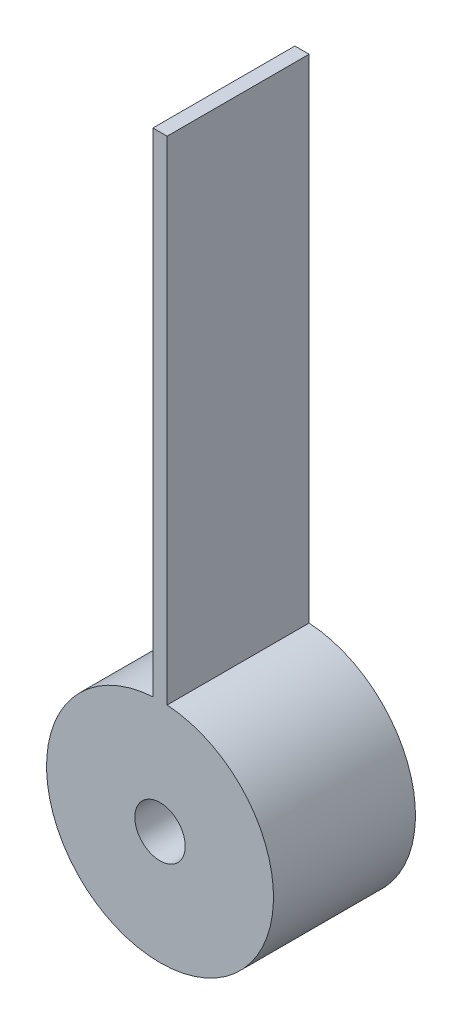
ISO-10303-21;
HEADER;
FILE_DESCRIPTION(('STEP AP214'),'2;1');
FILE_NAME('part.step','',(''),(''),'','','');
FILE_SCHEMA(('AUTOMOTIVE_DESIGN { 1 0 10303 214 1 1 1 1 }'));
ENDSEC;
DATA;
#1=APPLICATION_CONTEXT('core data for automotive mechanical design processes');
#2=APPLICATION_PROTOCOL_DEFINITION('international standard','automotive_design',2000,#1);
#3=PRODUCT_CONTEXT('',#1,'mechanical');
#4=PRODUCT('Part','Part','',(#3));
#5=PRODUCT_RELATED_PRODUCT_CATEGORY('part','',(#4));
#6=PRODUCT_DEFINITION_FORMATION('','',#4);
#7=PRODUCT_DEFINITION_CONTEXT('part definition',#1,'design');
#8=PRODUCT_DEFINITION('design','',#6,#7);
#9=PRODUCT_DEFINITION_SHAPE('','',#8);
#10=(LENGTH_UNIT() NAMED_UNIT(*) SI_UNIT(.MILLI.,.METRE.));
#11=(NAMED_UNIT(*) PLANE_ANGLE_UNIT() SI_UNIT($,.RADIAN.));
#12=(NAMED_UNIT(*) SI_UNIT($,.STERADIAN.) SOLID_ANGLE_UNIT());
#13=UNCERTAINTY_MEASURE_WITH_UNIT(LENGTH_MEASURE(1.E-05),#10,'distance_accuracy_value','');
#14=(GEOMETRIC_REPRESENTATION_CONTEXT(3) GLOBAL_UNCERTAINTY_ASSIGNED_CONTEXT((#13)) GLOBAL_UNIT_ASSIGNED_CONTEXT((#10,
#11,#12)) REPRESENTATION_CONTEXT('',''));
#15=CARTESIAN_POINT('',(0.,0.,0.));
#16=DIRECTION('',(0.,0.,1.));
#17=DIRECTION('',(1.,0.,0.));
#18=AXIS2_PLACEMENT_3D('',#15,#16,#17);
#19=CARTESIAN_POINT('',(86.1429583512705,135.382551319034,10.));
#20=DIRECTION('',(0.,0.,-1.));
#21=DIRECTION('',(-1.,0.,0.));
#22=AXIS2_PLACEMENT_3D('',#19,#20,#21);
#23=CYLINDRICAL_SURFACE('',#22,7.99264562022096);
#24=CARTESIAN_POINT('',(86.1429583512705,135.382551319034,0.));
#25=DIRECTION('',(0.,0.,1.));
#26=DIRECTION('',(1.,0.,0.));
#27=AXIS2_PLACEMENT_3D('',#24,#25,#26);
#28=CIRCLE('',#27,7.99264562022096);
#29=CARTESIAN_POINT('',(85.6429583512705,143.359542231053,0.));
#30=VERTEX_POINT('',#29);
#31=CARTESIAN_POINT('',(86.6429583512705,143.359542231053,0.));
#32=VERTEX_POINT('',#31);
#33=EDGE_CURVE('E114',#30,#32,#28,.T.);
#34=ORIENTED_EDGE('',*,*,#33,.T.);
#35=DIRECTION('',(0.,0.,-1.));
#36=VECTOR('',#35,1.);
#37=CARTESIAN_POINT('',(86.6429583512705,143.359542231053,10.));
#38=LINE('',#37,#36);
#39=CARTESIAN_POINT('',(86.6429583512705,143.359542231053,10.));
#40=VERTEX_POINT('',#39);
#41=EDGE_CURVE('E11',#40,#32,#38,.T.);
#42=ORIENTED_EDGE('',*,*,#41,.F.);
#43=CARTESIAN_POINT('',(86.1429583512705,135.382551319034,10.));
#44=DIRECTION('',(0.,0.,1.));
#45=DIRECTION('',(1.,0.,0.));
#46=AXIS2_PLACEMENT_3D('',#43,#44,#45);
#47=CIRCLE('',#46,7.99264562022096);
#48=CARTESIAN_POINT('',(85.6429583512705,143.359542231053,10.));
#49=VERTEX_POINT('',#48);
#50=EDGE_CURVE('E82',#49,#40,#47,.T.);
#51=ORIENTED_EDGE('',*,*,#50,.F.);
#52=DIRECTION('',(0.,0.,-1.));
#53=VECTOR('',#52,1.);
#54=CARTESIAN_POINT('',(85.6429583512705,143.359542231053,10.));
#55=LINE('',#54,#53);
#56=EDGE_CURVE('E113',#49,#30,#55,.T.);
#57=ORIENTED_EDGE('',*,*,#56,.T.);
#58=EDGE_LOOP('',(#34,#42,#51,#57));
#59=FACE_BOUND('',#58,.T.);
#60=ADVANCED_FACE('F39',(#59),#23,.T.);
#61=CARTESIAN_POINT('',(86.6429583512705,0.,10.));
#62=DIRECTION('',(1.,0.,0.));
#63=DIRECTION('',(0.,0.,-1.));
#64=AXIS2_PLACEMENT_3D('',#61,#62,#63);
#65=PLANE('',#64);
#66=DIRECTION('',(0.,-1.,0.));
#67=VECTOR('',#66,1.);
#68=CARTESIAN_POINT('',(86.6429583512705,0.,0.));
#69=LINE('',#68,#67);
#70=CARTESIAN_POINT('',(86.6429583512705,178.058382983812,0.));
#71=VERTEX_POINT('',#70);
#72=EDGE_CURVE('E92',#71,#32,#69,.T.);
#73=ORIENTED_EDGE('',*,*,#72,.F.);
#74=DIRECTION('',(0.,0.,-1.));
#75=VECTOR('',#74,1.);
#76=CARTESIAN_POINT('',(86.6429583512705,178.058382983812,10.));
#77=LINE('',#76,#75);
#78=CARTESIAN_POINT('',(86.6429583512705,178.058382983812,10.));
#79=VERTEX_POINT('',#78);
#80=EDGE_CURVE('E48',#79,#71,#77,.T.);
#81=ORIENTED_EDGE('',*,*,#80,.F.);
#82=DIRECTION('',(0.,-1.,0.));
#83=VECTOR('',#82,1.);
#84=CARTESIAN_POINT('',(86.6429583512705,0.,10.));
#85=LINE('',#84,#83);
#86=EDGE_CURVE('E90',#79,#40,#85,.T.);
#87=ORIENTED_EDGE('',*,*,#86,.T.);
#88=ORIENTED_EDGE('',*,*,#41,.T.);
#89=EDGE_LOOP('',(#73,#81,#87,#88));
#90=FACE_BOUND('',#89,.T.);
#91=ADVANCED_FACE('F89',(#90),#65,.T.);
#92=CARTESIAN_POINT('',(0.,178.058382983812,10.));
#93=DIRECTION('',(0.,-1.,0.));
#94=DIRECTION('',(0.,0.,-1.));
#95=AXIS2_PLACEMENT_3D('',#92,#93,#94);
#96=PLANE('',#95);
#97=DIRECTION('',(-1.,0.,0.));
#98=VECTOR('',#97,1.);
#99=CARTESIAN_POINT('',(0.,178.058382983812,0.));
#100=LINE('',#99,#98);
#101=CARTESIAN_POINT('',(85.6429583512705,178.058382983812,0.));
#102=VERTEX_POINT('',#101);
#103=EDGE_CURVE('E71',#71,#102,#100,.T.);
#104=ORIENTED_EDGE('',*,*,#103,.T.);
#105=DIRECTION('',(0.,0.,-1.));
#106=VECTOR('',#105,1.);
#107=CARTESIAN_POINT('',(85.6429583512705,178.058382983812,10.));
#108=LINE('',#107,#106);
#109=CARTESIAN_POINT('',(85.6429583512705,178.058382983812,10.));
#110=VERTEX_POINT('',#109);
#111=EDGE_CURVE('E94',#110,#102,#108,.T.);
#112=ORIENTED_EDGE('',*,*,#111,.F.);
#113=DIRECTION('',(-1.,0.,0.));
#114=VECTOR('',#113,1.);
#115=CARTESIAN_POINT('',(0.,178.058382983812,10.));
#116=LINE('',#115,#114);
#117=EDGE_CURVE('E95',#79,#110,#116,.T.);
#118=ORIENTED_EDGE('',*,*,#117,.F.);
#119=ORIENTED_EDGE('',*,*,#80,.T.);
#120=EDGE_LOOP('',(#104,#112,#118,#119));
#121=FACE_BOUND('',#120,.T.);
#122=ADVANCED_FACE('F96',(#121),#96,.F.);
#123=CARTESIAN_POINT('',(85.6429583512705,0.,10.));
#124=DIRECTION('',(1.,0.,0.));
#125=DIRECTION('',(0.,0.,-1.));
#126=AXIS2_PLACEMENT_3D('',#123,#124,#125);
#127=PLANE('',#126);
#128=DIRECTION('',(0.,-1.,0.));
#129=VECTOR('',#128,1.);
#130=CARTESIAN_POINT('',(85.6429583512705,0.,0.));
#131=LINE('',#130,#129);
#132=EDGE_CURVE('E77',#102,#30,#131,.T.);
#133=ORIENTED_EDGE('',*,*,#132,.T.);
#134=ORIENTED_EDGE('',*,*,#56,.F.);
#135=DIRECTION('',(0.,-1.,0.));
#136=VECTOR('',#135,1.);
#137=CARTESIAN_POINT('',(85.6429583512705,0.,10.));
#138=LINE('',#137,#136);
#139=EDGE_CURVE('E56',#110,#49,#138,.T.);
#140=ORIENTED_EDGE('',*,*,#139,.F.);
#141=ORIENTED_EDGE('',*,*,#111,.T.);
#142=EDGE_LOOP('',(#133,#134,#140,#141));
#143=FACE_BOUND('',#142,.T.);
#144=ADVANCED_FACE('F130',(#143),#127,.F.);
#145=CARTESIAN_POINT('',(86.1429583512705,135.382551319034,10.));
#146=DIRECTION('',(0.,0.,-1.));
#147=DIRECTION('',(-1.,0.,0.));
#148=AXIS2_PLACEMENT_3D('',#145,#146,#147);
#149=CYLINDRICAL_SURFACE('',#148,1.77614347116022);
#150=CARTESIAN_POINT('',(86.1429583512705,135.382551319034,10.));
#151=DIRECTION('',(0.,0.,1.));
#152=DIRECTION('',(1.,0.,0.));
#153=AXIS2_PLACEMENT_3D('',#150,#151,#152);
#154=CIRCLE('',#153,1.77614347116022);
#155=CARTESIAN_POINT('',(87.9191018224307,135.382551319034,10.));
#156=VERTEX_POINT('',#155);
#157=EDGE_CURVE('E109',#156,#156,#154,.T.);
#158=ORIENTED_EDGE('',*,*,#157,.T.);
#159=EDGE_LOOP('',(#158));
#160=FACE_BOUND('',#159,.T.);
#161=CARTESIAN_POINT('',(86.1429583512705,135.382551319034,0.));
#162=DIRECTION('',(0.,0.,1.));
#163=DIRECTION('',(1.,0.,0.));
#164=AXIS2_PLACEMENT_3D('',#161,#162,#163);
#165=CIRCLE('',#164,1.77614347116022);
#166=CARTESIAN_POINT('',(87.9191018224307,135.382551319034,0.));
#167=VERTEX_POINT('',#166);
#168=EDGE_CURVE('E104',#167,#167,#165,.T.);
#169=ORIENTED_EDGE('',*,*,#168,.F.);
#170=EDGE_LOOP('',(#169));
#171=FACE_BOUND('',#170,.T.);
#172=ADVANCED_FACE('F147',(#160,#171),#149,.F.);
#173=CARTESIAN_POINT('',(0.,0.,10.));
#174=DIRECTION('',(0.,0.,1.));
#175=DIRECTION('',(1.,0.,0.));
#176=AXIS2_PLACEMENT_3D('',#173,#174,#175);
#177=PLANE('',#176);
#178=ORIENTED_EDGE('',*,*,#50,.T.);
#179=ORIENTED_EDGE('',*,*,#86,.F.);
#180=ORIENTED_EDGE('',*,*,#117,.T.);
#181=ORIENTED_EDGE('',*,*,#139,.T.);
#182=EDGE_LOOP('',(#178,#179,#180,#181));
#183=FACE_BOUND('',#182,.T.);
#184=ORIENTED_EDGE('',*,*,#157,.F.);
#185=EDGE_LOOP('',(#184));
#186=FACE_BOUND('',#185,.T.);
#187=ADVANCED_FACE('F99',(#183,#186),#177,.T.);
#188=CARTESIAN_POINT('',(0.,0.,0.));
#189=DIRECTION('',(0.,0.,1.));
#190=DIRECTION('',(1.,0.,0.));
#191=AXIS2_PLACEMENT_3D('',#188,#189,#190);
#192=PLANE('',#191);
#193=ORIENTED_EDGE('',*,*,#33,.F.);
#194=ORIENTED_EDGE('',*,*,#132,.F.);
#195=ORIENTED_EDGE('',*,*,#103,.F.);
#196=ORIENTED_EDGE('',*,*,#72,.T.);
#197=EDGE_LOOP('',(#193,#194,#195,#196));
#198=FACE_BOUND('',#197,.T.);
#199=ORIENTED_EDGE('',*,*,#168,.T.);
#200=EDGE_LOOP('',(#199));
#201=FACE_BOUND('',#200,.T.);
#202=ADVANCED_FACE('F133',(#198,#201),#192,.F.);
#203=CLOSED_SHELL('',(#60,#91,#122,#144,#172,#187,#202));
#204=MANIFOLD_SOLID_BREP('B2',#203);
#205=ADVANCED_BREP_SHAPE_REPRESENTATION('',(#18,#204),#14);
#206=SHAPE_DEFINITION_REPRESENTATION(#9,#205);
ENDSEC;
END-ISO-10303-21;
